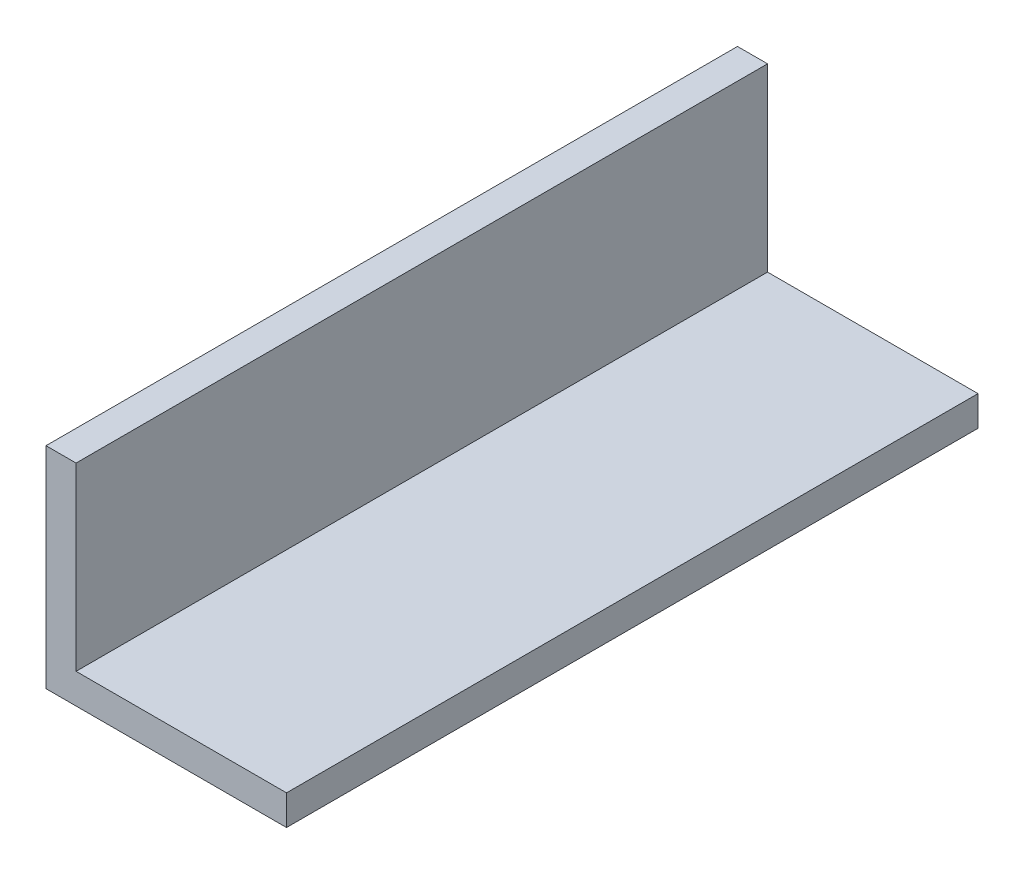
ISO-10303-21;
HEADER;
FILE_DESCRIPTION(('STEP AP214'),'2;1');
FILE_NAME('part.step','',(''),(''),'','','');
FILE_SCHEMA(('AUTOMOTIVE_DESIGN { 1 0 10303 214 1 1 1 1 }'));
ENDSEC;
DATA;
#1=APPLICATION_CONTEXT('core data for automotive mechanical design processes');
#2=APPLICATION_PROTOCOL_DEFINITION('international standard','automotive_design',2000,#1);
#3=PRODUCT_CONTEXT('',#1,'mechanical');
#4=PRODUCT('Part','Part','',(#3));
#5=PRODUCT_RELATED_PRODUCT_CATEGORY('part','',(#4));
#6=PRODUCT_DEFINITION_FORMATION('','',#4);
#7=PRODUCT_DEFINITION_CONTEXT('part definition',#1,'design');
#8=PRODUCT_DEFINITION('design','',#6,#7);
#9=PRODUCT_DEFINITION_SHAPE('','',#8);
#10=(LENGTH_UNIT() NAMED_UNIT(*) SI_UNIT(.MILLI.,.METRE.));
#11=(NAMED_UNIT(*) PLANE_ANGLE_UNIT() SI_UNIT($,.RADIAN.));
#12=(NAMED_UNIT(*) SI_UNIT($,.STERADIAN.) SOLID_ANGLE_UNIT());
#13=UNCERTAINTY_MEASURE_WITH_UNIT(LENGTH_MEASURE(1.E-05),#10,'distance_accuracy_value','');
#14=(GEOMETRIC_REPRESENTATION_CONTEXT(3) GLOBAL_UNCERTAINTY_ASSIGNED_CONTEXT((#13)) GLOBAL_UNIT_ASSIGNED_CONTEXT((#10,
#11,#12)) REPRESENTATION_CONTEXT('',''));
#15=CARTESIAN_POINT('',(0.,0.,0.));
#16=DIRECTION('',(0.,0.,1.));
#17=DIRECTION('',(1.,0.,0.));
#18=AXIS2_PLACEMENT_3D('',#15,#16,#17);
#19=CARTESIAN_POINT('',(-35.,0.,115.));
#20=DIRECTION('',(0.,-1.,0.));
#21=DIRECTION('',(0.,0.,-1.));
#22=AXIS2_PLACEMENT_3D('',#19,#20,#21);
#23=PLANE('',#22);
#24=DIRECTION('',(-1.,0.,0.));
#25=VECTOR('',#24,1.);
#26=CARTESIAN_POINT('',(-35.,0.,0.));
#27=LINE('',#26,#25);
#28=CARTESIAN_POINT('',(0.,0.,0.));
#29=VERTEX_POINT('',#28);
#30=CARTESIAN_POINT('',(-35.,0.,0.));
#31=VERTEX_POINT('',#30);
#32=EDGE_CURVE('E91',#29,#31,#27,.T.);
#33=ORIENTED_EDGE('',*,*,#32,.T.);
#34=DIRECTION('',(0.,0.,-1.));
#35=VECTOR('',#34,1.);
#36=CARTESIAN_POINT('',(-35.,0.,115.));
#37=LINE('',#36,#35);
#38=CARTESIAN_POINT('',(-35.,0.,115.));
#39=VERTEX_POINT('',#38);
#40=EDGE_CURVE('E11',#39,#31,#37,.T.);
#41=ORIENTED_EDGE('',*,*,#40,.F.);
#42=DIRECTION('',(-1.,0.,0.));
#43=VECTOR('',#42,1.);
#44=CARTESIAN_POINT('',(0.,0.,115.));
#45=LINE('',#44,#43);
#46=CARTESIAN_POINT('',(0.,0.,115.));
#47=VERTEX_POINT('',#46);
#48=EDGE_CURVE('E97',#47,#39,#45,.T.);
#49=ORIENTED_EDGE('',*,*,#48,.F.);
#50=DIRECTION('',(0.,0.,-1.));
#51=VECTOR('',#50,1.);
#52=CARTESIAN_POINT('',(0.,0.,115.));
#53=LINE('',#52,#51);
#54=EDGE_CURVE('E130',#47,#29,#53,.T.);
#55=ORIENTED_EDGE('',*,*,#54,.T.);
#56=EDGE_LOOP('',(#33,#41,#49,#55));
#57=FACE_BOUND('',#56,.T.);
#58=ADVANCED_FACE('F45',(#57),#23,.F.);
#59=CARTESIAN_POINT('',(-35.,0.,115.));
#60=DIRECTION('',(-1.,0.,0.));
#61=DIRECTION('',(0.,0.,1.));
#62=AXIS2_PLACEMENT_3D('',#59,#60,#61);
#63=PLANE('',#62);
#64=DIRECTION('',(0.,1.,0.));
#65=VECTOR('',#64,1.);
#66=CARTESIAN_POINT('',(-35.,0.,0.));
#67=LINE('',#66,#65);
#68=CARTESIAN_POINT('',(-35.,30.,0.));
#69=VERTEX_POINT('',#68);
#70=EDGE_CURVE('E136',#31,#69,#67,.T.);
#71=ORIENTED_EDGE('',*,*,#70,.T.);
#72=DIRECTION('',(0.,0.,-1.));
#73=VECTOR('',#72,1.);
#74=CARTESIAN_POINT('',(-35.,30.,115.));
#75=LINE('',#74,#73);
#76=CARTESIAN_POINT('',(-35.,30.,115.));
#77=VERTEX_POINT('',#76);
#78=EDGE_CURVE('E54',#77,#69,#75,.T.);
#79=ORIENTED_EDGE('',*,*,#78,.F.);
#80=DIRECTION('',(0.,1.,0.));
#81=VECTOR('',#80,1.);
#82=CARTESIAN_POINT('',(-35.,0.,115.));
#83=LINE('',#82,#81);
#84=EDGE_CURVE('E168',#39,#77,#83,.T.);
#85=ORIENTED_EDGE('',*,*,#84,.F.);
#86=ORIENTED_EDGE('',*,*,#40,.T.);
#87=EDGE_LOOP('',(#71,#79,#85,#86));
#88=FACE_BOUND('',#87,.T.);
#89=ADVANCED_FACE('F173',(#88),#63,.F.);
#90=CARTESIAN_POINT('',(-35.,30.,115.));
#91=DIRECTION('',(0.,-1.,0.));
#92=DIRECTION('',(0.,0.,-1.));
#93=AXIS2_PLACEMENT_3D('',#90,#91,#92);
#94=PLANE('',#93);
#95=DIRECTION('',(-1.,0.,0.));
#96=VECTOR('',#95,1.);
#97=CARTESIAN_POINT('',(-35.,30.,0.));
#98=LINE('',#97,#96);
#99=CARTESIAN_POINT('',(-40.,30.,0.));
#100=VERTEX_POINT('',#99);
#101=EDGE_CURVE('E139',#69,#100,#98,.T.);
#102=ORIENTED_EDGE('',*,*,#101,.T.);
#103=DIRECTION('',(0.,0.,-1.));
#104=VECTOR('',#103,1.);
#105=CARTESIAN_POINT('',(-40.,30.,115.));
#106=LINE('',#105,#104);
#107=CARTESIAN_POINT('',(-40.,30.,115.));
#108=VERTEX_POINT('',#107);
#109=EDGE_CURVE('E123',#108,#100,#106,.T.);
#110=ORIENTED_EDGE('',*,*,#109,.F.);
#111=DIRECTION('',(-1.,0.,0.));
#112=VECTOR('',#111,1.);
#113=CARTESIAN_POINT('',(-35.,30.,115.));
#114=LINE('',#113,#112);
#115=EDGE_CURVE('E111',#77,#108,#114,.T.);
#116=ORIENTED_EDGE('',*,*,#115,.F.);
#117=ORIENTED_EDGE('',*,*,#78,.T.);
#118=EDGE_LOOP('',(#102,#110,#116,#117));
#119=FACE_BOUND('',#118,.T.);
#120=ADVANCED_FACE('F160',(#119),#94,.F.);
#121=CARTESIAN_POINT('',(-40.,-5.,115.));
#122=DIRECTION('',(1.,0.,0.));
#123=DIRECTION('',(0.,0.,-1.));
#124=AXIS2_PLACEMENT_3D('',#121,#122,#123);
#125=PLANE('',#124);
#126=DIRECTION('',(0.,-1.,0.));
#127=VECTOR('',#126,1.);
#128=CARTESIAN_POINT('',(-40.,-5.,0.));
#129=LINE('',#128,#127);
#130=CARTESIAN_POINT('',(-40.,-5.,0.));
#131=VERTEX_POINT('',#130);
#132=EDGE_CURVE('E121',#100,#131,#129,.T.);
#133=ORIENTED_EDGE('',*,*,#132,.T.);
#134=DIRECTION('',(0.,0.,-1.));
#135=VECTOR('',#134,1.);
#136=CARTESIAN_POINT('',(-40.,-5.,115.));
#137=LINE('',#136,#135);
#138=CARTESIAN_POINT('',(-40.,-5.,115.));
#139=VERTEX_POINT('',#138);
#140=EDGE_CURVE('E118',#139,#131,#137,.T.);
#141=ORIENTED_EDGE('',*,*,#140,.F.);
#142=DIRECTION('',(0.,-1.,0.));
#143=VECTOR('',#142,1.);
#144=CARTESIAN_POINT('',(-40.,-5.,115.));
#145=LINE('',#144,#143);
#146=EDGE_CURVE('E105',#108,#139,#145,.T.);
#147=ORIENTED_EDGE('',*,*,#146,.F.);
#148=ORIENTED_EDGE('',*,*,#109,.T.);
#149=EDGE_LOOP('',(#133,#141,#147,#148));
#150=FACE_BOUND('',#149,.T.);
#151=ADVANCED_FACE('F119',(#150),#125,.F.);
#152=CARTESIAN_POINT('',(0.,-5.,115.));
#153=DIRECTION('',(0.,1.,0.));
#154=DIRECTION('',(0.,0.,1.));
#155=AXIS2_PLACEMENT_3D('',#152,#153,#154);
#156=PLANE('',#155);
#157=DIRECTION('',(1.,0.,0.));
#158=VECTOR('',#157,1.);
#159=CARTESIAN_POINT('',(0.,-5.,0.));
#160=LINE('',#159,#158);
#161=CARTESIAN_POINT('',(0.,-5.,0.));
#162=VERTEX_POINT('',#161);
#163=EDGE_CURVE('E84',#131,#162,#160,.T.);
#164=ORIENTED_EDGE('',*,*,#163,.T.);
#165=DIRECTION('',(0.,0.,-1.));
#166=VECTOR('',#165,1.);
#167=CARTESIAN_POINT('',(0.,-5.,115.));
#168=LINE('',#167,#166);
#169=CARTESIAN_POINT('',(0.,-5.,115.));
#170=VERTEX_POINT('',#169);
#171=EDGE_CURVE('E124',#170,#162,#168,.T.);
#172=ORIENTED_EDGE('',*,*,#171,.F.);
#173=DIRECTION('',(1.,0.,0.));
#174=VECTOR('',#173,1.);
#175=CARTESIAN_POINT('',(-35.,-5.,115.));
#176=LINE('',#175,#174);
#177=EDGE_CURVE('E109',#139,#170,#176,.T.);
#178=ORIENTED_EDGE('',*,*,#177,.F.);
#179=ORIENTED_EDGE('',*,*,#140,.T.);
#180=EDGE_LOOP('',(#164,#172,#178,#179));
#181=FACE_BOUND('',#180,.T.);
#182=ADVANCED_FACE('F126',(#181),#156,.F.);
#183=CARTESIAN_POINT('',(0.,0.,115.));
#184=DIRECTION('',(-1.,0.,0.));
#185=DIRECTION('',(0.,-1.,0.));
#186=AXIS2_PLACEMENT_3D('',#183,#184,#185);
#187=PLANE('',#186);
#188=DIRECTION('',(0.,1.,0.));
#189=VECTOR('',#188,1.);
#190=CARTESIAN_POINT('',(0.,0.,0.));
#191=LINE('',#190,#189);
#192=EDGE_CURVE('E146',#162,#29,#191,.T.);
#193=ORIENTED_EDGE('',*,*,#192,.T.);
#194=ORIENTED_EDGE('',*,*,#54,.F.);
#195=DIRECTION('',(0.,1.,0.));
#196=VECTOR('',#195,1.);
#197=CARTESIAN_POINT('',(0.,0.,115.));
#198=LINE('',#197,#196);
#199=EDGE_CURVE('E62',#170,#47,#198,.T.);
#200=ORIENTED_EDGE('',*,*,#199,.F.);
#201=ORIENTED_EDGE('',*,*,#171,.T.);
#202=EDGE_LOOP('',(#193,#194,#200,#201));
#203=FACE_BOUND('',#202,.T.);
#204=ADVANCED_FACE('F165',(#203),#187,.F.);
#205=CARTESIAN_POINT('',(0.,0.,115.));
#206=DIRECTION('',(0.,0.,-1.));
#207=DIRECTION('',(-1.,0.,0.));
#208=AXIS2_PLACEMENT_3D('',#205,#206,#207);
#209=PLANE('',#208);
#210=ORIENTED_EDGE('',*,*,#48,.T.);
#211=ORIENTED_EDGE('',*,*,#84,.T.);
#212=ORIENTED_EDGE('',*,*,#115,.T.);
#213=ORIENTED_EDGE('',*,*,#146,.T.);
#214=ORIENTED_EDGE('',*,*,#177,.T.);
#215=ORIENTED_EDGE('',*,*,#199,.T.);
#216=EDGE_LOOP('',(#210,#211,#212,#213,#214,#215));
#217=FACE_BOUND('',#216,.T.);
#218=ADVANCED_FACE('F107',(#217),#209,.F.);
#219=CARTESIAN_POINT('',(0.,0.,0.));
#220=DIRECTION('',(0.,0.,-1.));
#221=DIRECTION('',(-1.,0.,0.));
#222=AXIS2_PLACEMENT_3D('',#219,#220,#221);
#223=PLANE('',#222);
#224=ORIENTED_EDGE('',*,*,#32,.F.);
#225=ORIENTED_EDGE('',*,*,#192,.F.);
#226=ORIENTED_EDGE('',*,*,#163,.F.);
#227=ORIENTED_EDGE('',*,*,#132,.F.);
#228=ORIENTED_EDGE('',*,*,#101,.F.);
#229=ORIENTED_EDGE('',*,*,#70,.F.);
#230=EDGE_LOOP('',(#224,#225,#226,#227,#228,#229));
#231=FACE_BOUND('',#230,.T.);
#232=ADVANCED_FACE('F163',(#231),#223,.T.);
#233=CLOSED_SHELL('',(#58,#89,#120,#151,#182,#204,#218,#232));
#234=MANIFOLD_SOLID_BREP('B2',#233);
#235=ADVANCED_BREP_SHAPE_REPRESENTATION('',(#18,#234),#14);
#236=SHAPE_DEFINITION_REPRESENTATION(#9,#235);
ENDSEC;
END-ISO-10303-21;
